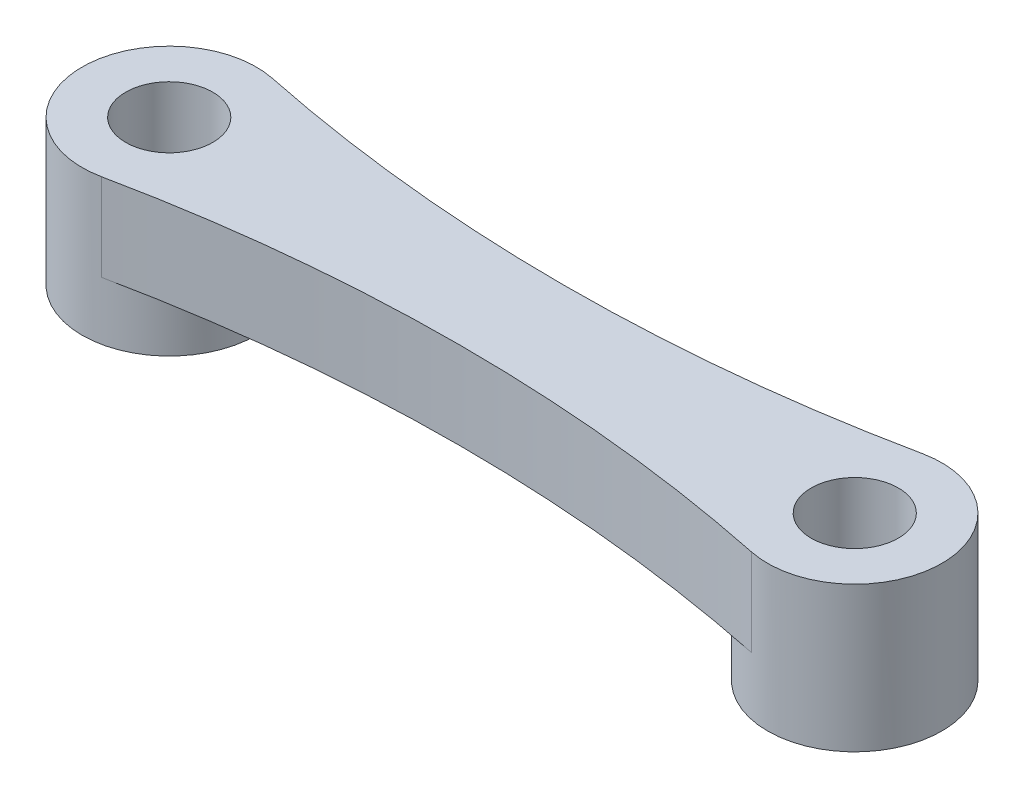
ISO-10303-21;
HEADER;
FILE_DESCRIPTION(('STEP AP214'),'2;1');
FILE_NAME('part.step','',(''),(''),'','','');
FILE_SCHEMA(('AUTOMOTIVE_DESIGN { 1 0 10303 214 1 1 1 1 }'));
ENDSEC;
DATA;
#1=APPLICATION_CONTEXT('core data for automotive mechanical design processes');
#2=APPLICATION_PROTOCOL_DEFINITION('international standard','automotive_design',2000,#1);
#3=PRODUCT_CONTEXT('',#1,'mechanical');
#4=PRODUCT('Part','Part','',(#3));
#5=PRODUCT_RELATED_PRODUCT_CATEGORY('part','',(#4));
#6=PRODUCT_DEFINITION_FORMATION('','',#4);
#7=PRODUCT_DEFINITION_CONTEXT('part definition',#1,'design');
#8=PRODUCT_DEFINITION('design','',#6,#7);
#9=PRODUCT_DEFINITION_SHAPE('','',#8);
#10=(LENGTH_UNIT() NAMED_UNIT(*) SI_UNIT(.MILLI.,.METRE.));
#11=(NAMED_UNIT(*) PLANE_ANGLE_UNIT() SI_UNIT($,.RADIAN.));
#12=(NAMED_UNIT(*) SI_UNIT($,.STERADIAN.) SOLID_ANGLE_UNIT());
#13=UNCERTAINTY_MEASURE_WITH_UNIT(LENGTH_MEASURE(1.E-05),#10,'distance_accuracy_value','');
#14=(GEOMETRIC_REPRESENTATION_CONTEXT(3) GLOBAL_UNCERTAINTY_ASSIGNED_CONTEXT((#13)) GLOBAL_UNIT_ASSIGNED_CONTEXT((#10,
#11,#12)) REPRESENTATION_CONTEXT('',''));
#15=CARTESIAN_POINT('',(0.,0.,0.));
#16=DIRECTION('',(0.,0.,1.));
#17=DIRECTION('',(1.,0.,0.));
#18=AXIS2_PLACEMENT_3D('',#15,#16,#17);
#19=CARTESIAN_POINT('',(-11.8,3.,0.));
#20=DIRECTION('',(0.,1.,0.));
#21=DIRECTION('',(0.,0.,1.));
#22=AXIS2_PLACEMENT_3D('',#19,#20,#21);
#23=PLANE('',#22);
#24=CARTESIAN_POINT('',(-11.8,3.,0.));
#25=DIRECTION('',(0.,1.,0.));
#26=DIRECTION('',(0.,0.,1.));
#27=AXIS2_PLACEMENT_3D('',#24,#25,#26);
#28=CIRCLE('',#27,1.5);
#29=CARTESIAN_POINT('',(-11.8,3.,1.5));
#30=VERTEX_POINT('',#29);
#31=EDGE_CURVE('E142',#30,#30,#28,.T.);
#32=ORIENTED_EDGE('',*,*,#31,.F.);
#33=EDGE_LOOP('',(#32));
#34=FACE_BOUND('',#33,.T.);
#35=CARTESIAN_POINT('',(11.8,3.,0.));
#36=DIRECTION('',(0.,1.,0.));
#37=DIRECTION('',(0.,0.,1.));
#38=AXIS2_PLACEMENT_3D('',#35,#36,#37);
#39=CIRCLE('',#38,1.5);
#40=CARTESIAN_POINT('',(11.8,3.,1.5));
#41=VERTEX_POINT('',#40);
#42=EDGE_CURVE('E135',#41,#41,#39,.T.);
#43=ORIENTED_EDGE('',*,*,#42,.F.);
#44=EDGE_LOOP('',(#43));
#45=FACE_BOUND('',#44,.T.);
#46=CARTESIAN_POINT('',(11.8,3.,0.));
#47=DIRECTION('',(0.,1.,0.));
#48=DIRECTION('',(0.,0.,1.));
#49=AXIS2_PLACEMENT_3D('',#46,#47,#48);
#50=CIRCLE('',#49,3.);
#51=CARTESIAN_POINT('',(11.1896551724138,3.,2.93725708637136));
#52=VERTEX_POINT('',#51);
#53=CARTESIAN_POINT('',(11.1896551724138,3.,-2.93725708637137));
#54=VERTEX_POINT('',#53);
#55=EDGE_CURVE('E13',#52,#54,#50,.T.);
#56=ORIENTED_EDGE('',*,*,#55,.T.);
#57=CARTESIAN_POINT('',(0.,3.,-56.7869703365129));
#58=DIRECTION('',(0.,-1.,0.));
#59=DIRECTION('',(0.,0.,1.));
#60=AXIS2_PLACEMENT_3D('',#57,#58,#59);
#61=CIRCLE('',#60,55.);
#62=CARTESIAN_POINT('',(-11.1896551724138,3.,-2.93725708637136));
#63=VERTEX_POINT('',#62);
#64=EDGE_CURVE('E127',#54,#63,#61,.T.);
#65=ORIENTED_EDGE('',*,*,#64,.T.);
#66=CARTESIAN_POINT('',(-11.8,3.,0.));
#67=DIRECTION('',(0.,1.,0.));
#68=DIRECTION('',(0.,0.,1.));
#69=AXIS2_PLACEMENT_3D('',#66,#67,#68);
#70=CIRCLE('',#69,3.);
#71=CARTESIAN_POINT('',(-11.1896551724138,3.,2.93725708637136));
#72=VERTEX_POINT('',#71);
#73=EDGE_CURVE('E61',#63,#72,#70,.T.);
#74=ORIENTED_EDGE('',*,*,#73,.T.);
#75=CARTESIAN_POINT('',(0.,3.,56.7869703365129));
#76=DIRECTION('',(0.,-1.,0.));
#77=DIRECTION('',(0.,0.,-1.));
#78=AXIS2_PLACEMENT_3D('',#75,#76,#77);
#79=CIRCLE('',#78,55.);
#80=EDGE_CURVE('E123',#72,#52,#79,.T.);
#81=ORIENTED_EDGE('',*,*,#80,.T.);
#82=EDGE_LOOP('',(#56,#65,#74,#81));
#83=FACE_BOUND('',#82,.T.);
#84=ADVANCED_FACE('F52',(#34,#45,#83),#23,.T.);
#85=CARTESIAN_POINT('',(-11.8,0.,0.));
#86=DIRECTION('',(0.,1.,0.));
#87=DIRECTION('',(0.,0.,1.));
#88=AXIS2_PLACEMENT_3D('',#85,#86,#87);
#89=PLANE('',#88);
#90=CARTESIAN_POINT('',(0.,0.,-56.7869703365129));
#91=DIRECTION('',(0.,-1.,0.));
#92=DIRECTION('',(0.,0.,1.));
#93=AXIS2_PLACEMENT_3D('',#90,#91,#92);
#94=CIRCLE('',#93,55.);
#95=CARTESIAN_POINT('',(11.1896551724138,0.,-2.93725708637137));
#96=VERTEX_POINT('',#95);
#97=CARTESIAN_POINT('',(-11.1896551724138,0.,-2.93725708637136));
#98=VERTEX_POINT('',#97);
#99=EDGE_CURVE('E97',#96,#98,#94,.T.);
#100=ORIENTED_EDGE('',*,*,#99,.F.);
#101=CARTESIAN_POINT('',(11.8,0.,0.));
#102=DIRECTION('',(0.,1.,0.));
#103=DIRECTION('',(0.,0.,1.));
#104=AXIS2_PLACEMENT_3D('',#101,#102,#103);
#105=CIRCLE('',#104,3.);
#106=CARTESIAN_POINT('',(11.1896551724138,0.,2.93725708637135));
#107=VERTEX_POINT('',#106);
#108=EDGE_CURVE('E91',#96,#107,#105,.T.);
#109=ORIENTED_EDGE('',*,*,#108,.T.);
#110=CARTESIAN_POINT('',(0.,0.,56.7869703365129));
#111=DIRECTION('',(0.,-1.,0.));
#112=DIRECTION('',(0.,0.,-1.));
#113=AXIS2_PLACEMENT_3D('',#110,#111,#112);
#114=CIRCLE('',#113,55.);
#115=CARTESIAN_POINT('',(-11.1896551724138,0.,2.93725708637136));
#116=VERTEX_POINT('',#115);
#117=EDGE_CURVE('E95',#116,#107,#114,.T.);
#118=ORIENTED_EDGE('',*,*,#117,.F.);
#119=CARTESIAN_POINT('',(-11.8,0.,0.));
#120=DIRECTION('',(0.,1.,0.));
#121=DIRECTION('',(0.,0.,1.));
#122=AXIS2_PLACEMENT_3D('',#119,#120,#121);
#123=CIRCLE('',#122,3.);
#124=EDGE_CURVE('E68',#116,#98,#123,.T.);
#125=ORIENTED_EDGE('',*,*,#124,.T.);
#126=EDGE_LOOP('',(#100,#109,#118,#125));
#127=FACE_BOUND('',#126,.T.);
#128=ADVANCED_FACE('F93',(#127),#89,.F.);
#129=CARTESIAN_POINT('',(-11.8,3.,0.));
#130=DIRECTION('',(0.,-1.,0.));
#131=DIRECTION('',(0.,0.,-1.));
#132=AXIS2_PLACEMENT_3D('',#129,#130,#131);
#133=CYLINDRICAL_SURFACE('',#132,3.);
#134=DIRECTION('',(0.,1.,0.));
#135=VECTOR('',#134,1.);
#136=CARTESIAN_POINT('',(-11.1896551724138,0.,-2.93725708637136));
#137=LINE('',#136,#135);
#138=EDGE_CURVE('E118',#98,#63,#137,.T.);
#139=ORIENTED_EDGE('',*,*,#138,.F.);
#140=ORIENTED_EDGE('',*,*,#124,.F.);
#141=DIRECTION('',(0.,1.,0.));
#142=VECTOR('',#141,1.);
#143=CARTESIAN_POINT('',(-11.1896551724138,0.,2.93725708637136));
#144=LINE('',#143,#142);
#145=EDGE_CURVE('E114',#116,#72,#144,.T.);
#146=ORIENTED_EDGE('',*,*,#145,.T.);
#147=ORIENTED_EDGE('',*,*,#73,.F.);
#148=EDGE_LOOP('',(#139,#140,#146,#147));
#149=FACE_BOUND('',#148,.T.);
#150=CARTESIAN_POINT('',(-11.8,-2.,0.));
#151=DIRECTION('',(0.,1.,0.));
#152=DIRECTION('',(0.,0.,1.));
#153=AXIS2_PLACEMENT_3D('',#150,#151,#152);
#154=CIRCLE('',#153,3.);
#155=CARTESIAN_POINT('',(-11.8,-2.,3.));
#156=VERTEX_POINT('',#155);
#157=EDGE_CURVE('E131',#156,#156,#154,.T.);
#158=ORIENTED_EDGE('',*,*,#157,.T.);
#159=EDGE_LOOP('',(#158));
#160=FACE_BOUND('',#159,.T.);
#161=ADVANCED_FACE('F54',(#149,#160),#133,.T.);
#162=CARTESIAN_POINT('',(11.8,3.,0.));
#163=DIRECTION('',(0.,-1.,0.));
#164=DIRECTION('',(0.,0.,-1.));
#165=AXIS2_PLACEMENT_3D('',#162,#163,#164);
#166=CYLINDRICAL_SURFACE('',#165,3.);
#167=DIRECTION('',(0.,1.,0.));
#168=VECTOR('',#167,1.);
#169=CARTESIAN_POINT('',(11.1896551724138,0.,2.93725708637136));
#170=LINE('',#169,#168);
#171=EDGE_CURVE('E106',#107,#52,#170,.T.);
#172=ORIENTED_EDGE('',*,*,#171,.F.);
#173=ORIENTED_EDGE('',*,*,#108,.F.);
#174=DIRECTION('',(0.,1.,0.));
#175=VECTOR('',#174,1.);
#176=CARTESIAN_POINT('',(11.1896551724138,0.,-2.93725708637137));
#177=LINE('',#176,#175);
#178=EDGE_CURVE('E113',#96,#54,#177,.T.);
#179=ORIENTED_EDGE('',*,*,#178,.T.);
#180=ORIENTED_EDGE('',*,*,#55,.F.);
#181=EDGE_LOOP('',(#172,#173,#179,#180));
#182=FACE_BOUND('',#181,.T.);
#183=CARTESIAN_POINT('',(11.8,-2.,0.));
#184=DIRECTION('',(0.,1.,0.));
#185=DIRECTION('',(0.,0.,1.));
#186=AXIS2_PLACEMENT_3D('',#183,#184,#185);
#187=CIRCLE('',#186,3.);
#188=CARTESIAN_POINT('',(11.8,-2.,3.));
#189=VERTEX_POINT('',#188);
#190=EDGE_CURVE('E102',#189,#189,#187,.T.);
#191=ORIENTED_EDGE('',*,*,#190,.T.);
#192=EDGE_LOOP('',(#191));
#193=FACE_BOUND('',#192,.T.);
#194=ADVANCED_FACE('F107',(#182,#193),#166,.T.);
#195=CARTESIAN_POINT('',(-11.8,3.,0.));
#196=DIRECTION('',(0.,-1.,0.));
#197=DIRECTION('',(0.,0.,-1.));
#198=AXIS2_PLACEMENT_3D('',#195,#196,#197);
#199=CYLINDRICAL_SURFACE('',#198,1.5);
#200=ORIENTED_EDGE('',*,*,#31,.T.);
#201=EDGE_LOOP('',(#200));
#202=FACE_BOUND('',#201,.T.);
#203=CARTESIAN_POINT('',(-11.8,-2.,0.));
#204=DIRECTION('',(0.,1.,0.));
#205=DIRECTION('',(0.,0.,1.));
#206=AXIS2_PLACEMENT_3D('',#203,#204,#205);
#207=CIRCLE('',#206,1.5);
#208=CARTESIAN_POINT('',(-11.8,-2.,1.5));
#209=VERTEX_POINT('',#208);
#210=EDGE_CURVE('E156',#209,#209,#207,.T.);
#211=ORIENTED_EDGE('',*,*,#210,.F.);
#212=EDGE_LOOP('',(#211));
#213=FACE_BOUND('',#212,.T.);
#214=ADVANCED_FACE('F174',(#202,#213),#199,.F.);
#215=CARTESIAN_POINT('',(11.8,3.,0.));
#216=DIRECTION('',(0.,-1.,0.));
#217=DIRECTION('',(0.,0.,-1.));
#218=AXIS2_PLACEMENT_3D('',#215,#216,#217);
#219=CYLINDRICAL_SURFACE('',#218,1.5);
#220=ORIENTED_EDGE('',*,*,#42,.T.);
#221=EDGE_LOOP('',(#220));
#222=FACE_BOUND('',#221,.T.);
#223=CARTESIAN_POINT('',(11.8,-2.,0.));
#224=DIRECTION('',(0.,1.,0.));
#225=DIRECTION('',(0.,0.,1.));
#226=AXIS2_PLACEMENT_3D('',#223,#224,#225);
#227=CIRCLE('',#226,1.5);
#228=CARTESIAN_POINT('',(11.8,-2.,1.5));
#229=VERTEX_POINT('',#228);
#230=EDGE_CURVE('E103',#229,#229,#227,.T.);
#231=ORIENTED_EDGE('',*,*,#230,.F.);
#232=EDGE_LOOP('',(#231));
#233=FACE_BOUND('',#232,.T.);
#234=ADVANCED_FACE('F171',(#222,#233),#219,.F.);
#235=CARTESIAN_POINT('',(0.,0.,-56.7869703365129));
#236=DIRECTION('',(0.,1.,0.));
#237=DIRECTION('',(0.,0.,1.));
#238=AXIS2_PLACEMENT_3D('',#235,#236,#237);
#239=CYLINDRICAL_SURFACE('',#238,55.);
#240=ORIENTED_EDGE('',*,*,#64,.F.);
#241=ORIENTED_EDGE('',*,*,#178,.F.);
#242=ORIENTED_EDGE('',*,*,#99,.T.);
#243=ORIENTED_EDGE('',*,*,#138,.T.);
#244=EDGE_LOOP('',(#240,#241,#242,#243));
#245=FACE_BOUND('',#244,.T.);
#246=ADVANCED_FACE('F173',(#245),#239,.F.);
#247=CARTESIAN_POINT('',(0.,0.,56.7869703365129));
#248=DIRECTION('',(0.,1.,0.));
#249=DIRECTION('',(0.,0.,1.));
#250=AXIS2_PLACEMENT_3D('',#247,#248,#249);
#251=CYLINDRICAL_SURFACE('',#250,55.);
#252=ORIENTED_EDGE('',*,*,#80,.F.);
#253=ORIENTED_EDGE('',*,*,#145,.F.);
#254=ORIENTED_EDGE('',*,*,#117,.T.);
#255=ORIENTED_EDGE('',*,*,#171,.T.);
#256=EDGE_LOOP('',(#252,#253,#254,#255));
#257=FACE_BOUND('',#256,.T.);
#258=ADVANCED_FACE('F116',(#257),#251,.F.);
#259=CARTESIAN_POINT('',(-11.8,-2.,0.));
#260=DIRECTION('',(0.,1.,0.));
#261=DIRECTION('',(0.,0.,1.));
#262=AXIS2_PLACEMENT_3D('',#259,#260,#261);
#263=PLANE('',#262);
#264=ORIENTED_EDGE('',*,*,#210,.T.);
#265=EDGE_LOOP('',(#264));
#266=FACE_BOUND('',#265,.T.);
#267=ORIENTED_EDGE('',*,*,#157,.F.);
#268=EDGE_LOOP('',(#267));
#269=FACE_BOUND('',#268,.T.);
#270=ADVANCED_FACE('F226',(#266,#269),#263,.F.);
#271=CARTESIAN_POINT('',(11.8,-2.,0.));
#272=DIRECTION('',(0.,1.,0.));
#273=DIRECTION('',(0.,0.,1.));
#274=AXIS2_PLACEMENT_3D('',#271,#272,#273);
#275=PLANE('',#274);
#276=ORIENTED_EDGE('',*,*,#230,.T.);
#277=EDGE_LOOP('',(#276));
#278=FACE_BOUND('',#277,.T.);
#279=ORIENTED_EDGE('',*,*,#190,.F.);
#280=EDGE_LOOP('',(#279));
#281=FACE_BOUND('',#280,.T.);
#282=ADVANCED_FACE('F168',(#278,#281),#275,.F.);
#283=CLOSED_SHELL('',(#84,#128,#161,#194,#214,#234,#246,#258,#270,#282));
#284=MANIFOLD_SOLID_BREP('B2',#283);
#285=ADVANCED_BREP_SHAPE_REPRESENTATION('',(#18,#284),#14);
#286=SHAPE_DEFINITION_REPRESENTATION(#9,#285);
ENDSEC;
END-ISO-10303-21;
